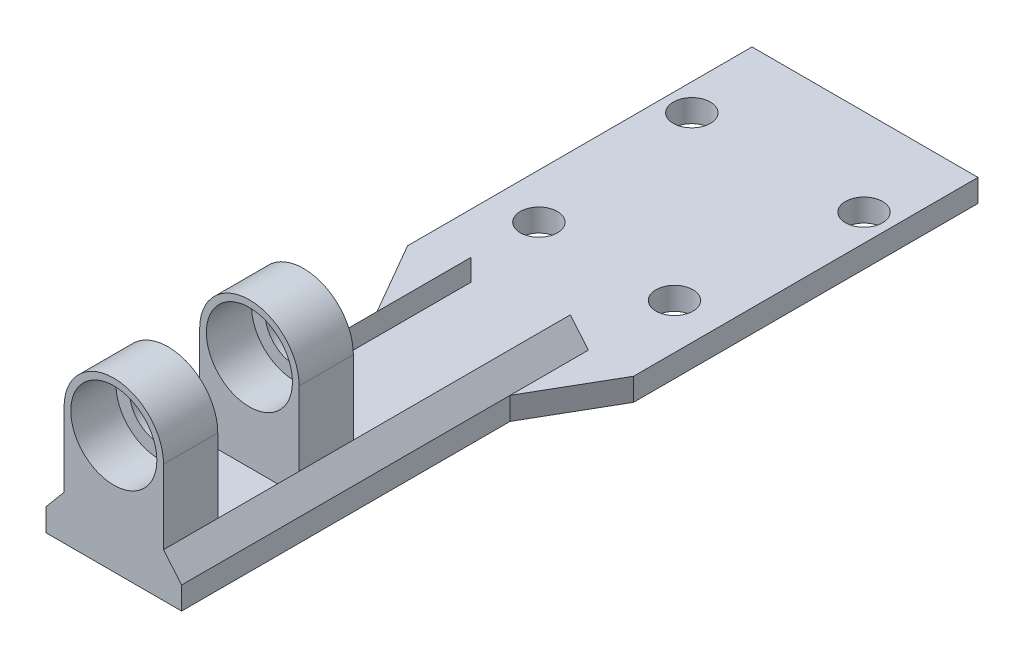
ISO-10303-21;
HEADER;
FILE_DESCRIPTION(('STEP AP214'),'2;1');
FILE_NAME('part.step','',(''),(''),'','','');
FILE_SCHEMA(('AUTOMOTIVE_DESIGN { 1 0 10303 214 1 1 1 1 }'));
ENDSEC;
DATA;
#1=APPLICATION_CONTEXT('core data for automotive mechanical design processes');
#2=APPLICATION_PROTOCOL_DEFINITION('international standard','automotive_design',2000,#1);
#3=PRODUCT_CONTEXT('',#1,'mechanical');
#4=PRODUCT('Part','Part','',(#3));
#5=PRODUCT_RELATED_PRODUCT_CATEGORY('part','',(#4));
#6=PRODUCT_DEFINITION_FORMATION('','',#4);
#7=PRODUCT_DEFINITION_CONTEXT('part definition',#1,'design');
#8=PRODUCT_DEFINITION('design','',#6,#7);
#9=PRODUCT_DEFINITION_SHAPE('','',#8);
#10=(LENGTH_UNIT() NAMED_UNIT(*) SI_UNIT(.MILLI.,.METRE.));
#11=(NAMED_UNIT(*) PLANE_ANGLE_UNIT() SI_UNIT($,.RADIAN.));
#12=(NAMED_UNIT(*) SI_UNIT($,.STERADIAN.) SOLID_ANGLE_UNIT());
#13=UNCERTAINTY_MEASURE_WITH_UNIT(LENGTH_MEASURE(1.E-05),#10,'distance_accuracy_value','');
#14=(GEOMETRIC_REPRESENTATION_CONTEXT(3) GLOBAL_UNCERTAINTY_ASSIGNED_CONTEXT((#13)) GLOBAL_UNIT_ASSIGNED_CONTEXT((#10,
#11,#12)) REPRESENTATION_CONTEXT('',''));
#15=CARTESIAN_POINT('',(0.,0.,0.));
#16=DIRECTION('',(0.,0.,1.));
#17=DIRECTION('',(1.,0.,0.));
#18=AXIS2_PLACEMENT_3D('',#15,#16,#17);
#19=CARTESIAN_POINT('',(0.,5.,0.));
#20=DIRECTION('',(0.,1.,0.));
#21=DIRECTION('',(0.,0.,1.));
#22=AXIS2_PLACEMENT_3D('',#19,#20,#21);
#23=PLANE('',#22);
#24=DIRECTION('',(0.,0.,1.));
#25=VECTOR('',#24,1.);
#26=CARTESIAN_POINT('',(11.,5.,-6.22289530744161));
#27=LINE('',#26,#25);
#28=CARTESIAN_POINT('',(11.,5.,0.));
#29=VERTEX_POINT('',#28);
#30=CARTESIAN_POINT('',(11.,5.,48.));
#31=VERTEX_POINT('',#30);
#32=EDGE_CURVE('E211',#29,#31,#27,.T.);
#33=ORIENTED_EDGE('',*,*,#32,.F.);
#34=DIRECTION('',(-1.,0.,0.));
#35=VECTOR('',#34,1.);
#36=CARTESIAN_POINT('',(11.,5.,0.));
#37=LINE('',#36,#35);
#38=CARTESIAN_POINT('',(15.,5.,0.));
#39=VERTEX_POINT('',#38);
#40=EDGE_CURVE('E195',#39,#29,#37,.T.);
#41=ORIENTED_EDGE('',*,*,#40,.F.);
#42=DIRECTION('',(0.,0.,1.));
#43=VECTOR('',#42,1.);
#44=CARTESIAN_POINT('',(15.,5.,-6.22289530744161));
#45=LINE('',#44,#43);
#46=CARTESIAN_POINT('',(15.,5.,17.3205080756889));
#47=VERTEX_POINT('',#46);
#48=EDGE_CURVE('E233',#39,#47,#45,.T.);
#49=ORIENTED_EDGE('',*,*,#48,.T.);
#50=DIRECTION('',(-0.499999999999998,0.,0.86602540378444));
#51=VECTOR('',#50,1.);
#52=CARTESIAN_POINT('',(15.,5.,17.3205080756889));
#53=LINE('',#52,#51);
#54=CARTESIAN_POINT('',(25.,5.,0.));
#55=VERTEX_POINT('',#54);
#56=EDGE_CURVE('E443',#55,#47,#53,.T.);
#57=ORIENTED_EDGE('',*,*,#56,.F.);
#58=DIRECTION('',(0.,0.,-1.));
#59=VECTOR('',#58,1.);
#60=CARTESIAN_POINT('',(25.,5.,-76.2));
#61=LINE('',#60,#59);
#62=CARTESIAN_POINT('',(25.,5.,-76.2));
#63=VERTEX_POINT('',#62);
#64=EDGE_CURVE('E318',#55,#63,#61,.T.);
#65=ORIENTED_EDGE('',*,*,#64,.T.);
#66=DIRECTION('',(-1.,0.,0.));
#67=VECTOR('',#66,1.);
#68=CARTESIAN_POINT('',(-25.0000000000001,5.,-76.2));
#69=LINE('',#68,#67);
#70=CARTESIAN_POINT('',(-25.0000000000001,5.,-76.2));
#71=VERTEX_POINT('',#70);
#72=EDGE_CURVE('E322',#63,#71,#69,.T.);
#73=ORIENTED_EDGE('',*,*,#72,.T.);
#74=DIRECTION('',(0.,0.,1.));
#75=VECTOR('',#74,1.);
#76=CARTESIAN_POINT('',(-25.0000000000001,5.,-38.1));
#77=LINE('',#76,#75);
#78=CARTESIAN_POINT('',(-25.,5.,0.));
#79=VERTEX_POINT('',#78);
#80=EDGE_CURVE('E326',#71,#79,#77,.T.);
#81=ORIENTED_EDGE('',*,*,#80,.T.);
#82=DIRECTION('',(-0.499999999999998,0.,-0.86602540378444));
#83=VECTOR('',#82,1.);
#84=CARTESIAN_POINT('',(-25.,5.,0.));
#85=LINE('',#84,#83);
#86=CARTESIAN_POINT('',(-15.,5.,17.3205080756889));
#87=VERTEX_POINT('',#86);
#88=EDGE_CURVE('E454',#87,#79,#85,.T.);
#89=ORIENTED_EDGE('',*,*,#88,.F.);
#90=DIRECTION('',(0.,0.,1.));
#91=VECTOR('',#90,1.);
#92=CARTESIAN_POINT('',(-15.,5.,-6.22289530744161));
#93=LINE('',#92,#91);
#94=CARTESIAN_POINT('',(-15.,5.,0.));
#95=VERTEX_POINT('',#94);
#96=EDGE_CURVE('E236',#95,#87,#93,.T.);
#97=ORIENTED_EDGE('',*,*,#96,.F.);
#98=DIRECTION('',(-1.,0.,0.));
#99=VECTOR('',#98,1.);
#100=CARTESIAN_POINT('',(-11.,5.,0.));
#101=LINE('',#100,#99);
#102=CARTESIAN_POINT('',(-11.,5.,0.));
#103=VERTEX_POINT('',#102);
#104=EDGE_CURVE('E244',#103,#95,#101,.T.);
#105=ORIENTED_EDGE('',*,*,#104,.F.);
#106=DIRECTION('',(0.,0.,1.));
#107=VECTOR('',#106,1.);
#108=CARTESIAN_POINT('',(-11.,5.,-6.22289530744161));
#109=LINE('',#108,#107);
#110=CARTESIAN_POINT('',(-11.,5.,48.));
#111=VERTEX_POINT('',#110);
#112=EDGE_CURVE('E248',#103,#111,#109,.T.);
#113=ORIENTED_EDGE('',*,*,#112,.T.);
#114=DIRECTION('',(1.,0.,0.));
#115=VECTOR('',#114,1.);
#116=CARTESIAN_POINT('',(15.,5.,48.));
#117=LINE('',#116,#115);
#118=EDGE_CURVE('E220',#111,#31,#117,.T.);
#119=ORIENTED_EDGE('',*,*,#118,.T.);
#120=EDGE_LOOP('',(#33,#41,#49,#57,#65,#73,#81,#89,#97,#105,#113,#119));
#121=FACE_BOUND('',#120,.T.);
#122=CARTESIAN_POINT('',(-19.05,5.,-56.9341325623275));
#123=DIRECTION('',(0.,1.,0.));
#124=DIRECTION('',(0.,0.,1.));
#125=AXIS2_PLACEMENT_3D('',#122,#123,#124);
#126=CIRCLE('',#125,4.1);
#127=CARTESIAN_POINT('',(-19.05,5.,-52.8341325623275));
#128=VERTEX_POINT('',#127);
#129=EDGE_CURVE('E277',#128,#128,#126,.T.);
#130=ORIENTED_EDGE('',*,*,#129,.F.);
#131=EDGE_LOOP('',(#130));
#132=FACE_BOUND('',#131,.T.);
#133=CARTESIAN_POINT('',(19.05,5.,-56.9341325623275));
#134=DIRECTION('',(0.,1.,0.));
#135=DIRECTION('',(0.,0.,1.));
#136=AXIS2_PLACEMENT_3D('',#133,#134,#135);
#137=CIRCLE('',#136,4.1);
#138=CARTESIAN_POINT('',(19.05,5.,-52.8341325623275));
#139=VERTEX_POINT('',#138);
#140=EDGE_CURVE('E306',#139,#139,#137,.T.);
#141=ORIENTED_EDGE('',*,*,#140,.F.);
#142=EDGE_LOOP('',(#141));
#143=FACE_BOUND('',#142,.T.);
#144=CARTESIAN_POINT('',(-15.0000000000001,5.,-19.05));
#145=DIRECTION('',(0.,1.,0.));
#146=DIRECTION('',(0.,0.,1.));
#147=AXIS2_PLACEMENT_3D('',#144,#145,#146);
#148=CIRCLE('',#147,4.1);
#149=CARTESIAN_POINT('',(-15.0000000000001,5.,-14.95));
#150=VERTEX_POINT('',#149);
#151=EDGE_CURVE('E310',#150,#150,#148,.T.);
#152=ORIENTED_EDGE('',*,*,#151,.F.);
#153=EDGE_LOOP('',(#152));
#154=FACE_BOUND('',#153,.T.);
#155=CARTESIAN_POINT('',(15.,5.,-19.05));
#156=DIRECTION('',(0.,1.,0.));
#157=DIRECTION('',(0.,0.,1.));
#158=AXIS2_PLACEMENT_3D('',#155,#156,#157);
#159=CIRCLE('',#158,4.1);
#160=CARTESIAN_POINT('',(15.,5.,-14.95));
#161=VERTEX_POINT('',#160);
#162=EDGE_CURVE('E314',#161,#161,#159,.T.);
#163=ORIENTED_EDGE('',*,*,#162,.F.);
#164=EDGE_LOOP('',(#163));
#165=FACE_BOUND('',#164,.T.);
#166=ADVANCED_FACE('F43',(#121,#132,#143,#154,#165),#23,.T.);
#167=CARTESIAN_POINT('',(11.,5.,60.));
#168=VERTEX_POINT('',#167);
#169=CARTESIAN_POINT('',(11.,5.,78.));
#170=VERTEX_POINT('',#169);
#171=EDGE_CURVE('E66',#168,#170,#27,.T.);
#172=ORIENTED_EDGE('',*,*,#171,.F.);
#173=DIRECTION('',(1.,0.,0.));
#174=VECTOR('',#173,1.);
#175=CARTESIAN_POINT('',(15.,5.,60.));
#176=LINE('',#175,#174);
#177=CARTESIAN_POINT('',(-11.,5.,60.));
#178=VERTEX_POINT('',#177);
#179=EDGE_CURVE('E342',#178,#168,#176,.T.);
#180=ORIENTED_EDGE('',*,*,#179,.F.);
#181=CARTESIAN_POINT('',(-11.,5.,78.));
#182=VERTEX_POINT('',#181);
#183=EDGE_CURVE('E251',#178,#182,#109,.T.);
#184=ORIENTED_EDGE('',*,*,#183,.T.);
#185=DIRECTION('',(1.,0.,0.));
#186=VECTOR('',#185,1.);
#187=CARTESIAN_POINT('',(15.,5.,78.));
#188=LINE('',#187,#186);
#189=EDGE_CURVE('E396',#182,#170,#188,.T.);
#190=ORIENTED_EDGE('',*,*,#189,.T.);
#191=EDGE_LOOP('',(#172,#180,#184,#190));
#192=FACE_BOUND('',#191,.T.);
#193=ADVANCED_FACE('F597',(#192),#23,.T.);
#194=CARTESIAN_POINT('',(-25.,5.,0.));
#195=DIRECTION('',(-0.86602540378444,0.,0.499999999999998));
#196=DIRECTION('',(0.499999999999998,0.,0.86602540378444));
#197=AXIS2_PLACEMENT_3D('',#194,#195,#196);
#198=PLANE('',#197);
#199=DIRECTION('',(-0.499999999999998,0.,-0.86602540378444));
#200=VECTOR('',#199,1.);
#201=CARTESIAN_POINT('',(-25.,0.,0.));
#202=LINE('',#201,#200);
#203=CARTESIAN_POINT('',(-15.,0.,17.3205080756889));
#204=VERTEX_POINT('',#203);
#205=CARTESIAN_POINT('',(-25.,0.,0.));
#206=VERTEX_POINT('',#205);
#207=EDGE_CURVE('E448',#204,#206,#202,.T.);
#208=ORIENTED_EDGE('',*,*,#207,.F.);
#209=DIRECTION('',(0.,-1.,0.));
#210=VECTOR('',#209,1.);
#211=CARTESIAN_POINT('',(-15.,5.,17.3205080756889));
#212=LINE('',#211,#210);
#213=EDGE_CURVE('E479',#87,#204,#212,.T.);
#214=ORIENTED_EDGE('',*,*,#213,.F.);
#215=ORIENTED_EDGE('',*,*,#88,.T.);
#216=DIRECTION('',(0.,-1.,0.));
#217=VECTOR('',#216,1.);
#218=CARTESIAN_POINT('',(-25.,5.,0.));
#219=LINE('',#218,#217);
#220=EDGE_CURVE('E476',#79,#206,#219,.T.);
#221=ORIENTED_EDGE('',*,*,#220,.T.);
#222=EDGE_LOOP('',(#208,#214,#215,#221));
#223=FACE_BOUND('',#222,.T.);
#224=ADVANCED_FACE('F569',(#223),#198,.T.);
#225=CARTESIAN_POINT('',(-15.,5.,17.3205080756889));
#226=DIRECTION('',(-1.,0.,0.));
#227=DIRECTION('',(0.,0.,1.));
#228=AXIS2_PLACEMENT_3D('',#225,#226,#227);
#229=PLANE('',#228);
#230=DIRECTION('',(0.,0.,-1.));
#231=VECTOR('',#230,1.);
#232=CARTESIAN_POINT('',(-15.,0.,17.3205080756889));
#233=LINE('',#232,#231);
#234=CARTESIAN_POINT('',(-15.,0.,90.));
#235=VERTEX_POINT('',#234);
#236=EDGE_CURVE('E469',#235,#204,#233,.T.);
#237=ORIENTED_EDGE('',*,*,#236,.F.);
#238=DIRECTION('',(0.,-1.,0.));
#239=VECTOR('',#238,1.);
#240=CARTESIAN_POINT('',(-15.,5.,90.));
#241=LINE('',#240,#239);
#242=CARTESIAN_POINT('',(-15.,5.,90.));
#243=VERTEX_POINT('',#242);
#244=EDGE_CURVE('E482',#243,#235,#241,.T.);
#245=ORIENTED_EDGE('',*,*,#244,.F.);
#246=DIRECTION('',(0.,0.,-1.));
#247=VECTOR('',#246,1.);
#248=CARTESIAN_POINT('',(-15.,5.,17.3205080756889));
#249=LINE('',#248,#247);
#250=EDGE_CURVE('E451',#243,#87,#249,.T.);
#251=ORIENTED_EDGE('',*,*,#250,.T.);
#252=ORIENTED_EDGE('',*,*,#213,.T.);
#253=EDGE_LOOP('',(#237,#245,#251,#252));
#254=FACE_BOUND('',#253,.T.);
#255=ADVANCED_FACE('F577',(#254),#229,.T.);
#256=CARTESIAN_POINT('',(-15.,5.,90.));
#257=DIRECTION('',(0.,0.,1.));
#258=DIRECTION('',(1.,0.,0.));
#259=AXIS2_PLACEMENT_3D('',#256,#257,#258);
#260=PLANE('',#259);
#261=DIRECTION('',(0.,-1.,0.));
#262=VECTOR('',#261,1.);
#263=CARTESIAN_POINT('',(15.,5.,90.));
#264=LINE('',#263,#262);
#265=CARTESIAN_POINT('',(15.,5.,90.));
#266=VERTEX_POINT('',#265);
#267=CARTESIAN_POINT('',(15.,0.,90.));
#268=VERTEX_POINT('',#267);
#269=EDGE_CURVE('E485',#266,#268,#264,.T.);
#270=ORIENTED_EDGE('',*,*,#269,.F.);
#271=DIRECTION('',(-0.642787609686544,0.766044443118974,0.));
#272=VECTOR('',#271,1.);
#273=CARTESIAN_POINT('',(11.,9.76701437037679,90.));
#274=LINE('',#273,#272);
#275=CARTESIAN_POINT('',(11.,9.76701437037679,90.));
#276=VERTEX_POINT('',#275);
#277=EDGE_CURVE('E392',#266,#276,#274,.T.);
#278=ORIENTED_EDGE('',*,*,#277,.T.);
#279=DIRECTION('',(0.,1.,0.));
#280=VECTOR('',#279,1.);
#281=CARTESIAN_POINT('',(11.,26.15,90.));
#282=LINE('',#281,#280);
#283=CARTESIAN_POINT('',(11.,26.15,90.));
#284=VERTEX_POINT('',#283);
#285=EDGE_CURVE('E416',#276,#284,#282,.T.);
#286=ORIENTED_EDGE('',*,*,#285,.T.);
#287=CARTESIAN_POINT('',(0.,26.15,90.));
#288=DIRECTION('',(0.,0.,1.));
#289=DIRECTION('',(1.,0.,0.));
#290=AXIS2_PLACEMENT_3D('',#287,#288,#289);
#291=CIRCLE('',#290,11.);
#292=CARTESIAN_POINT('',(-11.,26.15,90.));
#293=VERTEX_POINT('',#292);
#294=EDGE_CURVE('E420',#284,#293,#291,.T.);
#295=ORIENTED_EDGE('',*,*,#294,.T.);
#296=DIRECTION('',(0.,-1.,0.));
#297=VECTOR('',#296,1.);
#298=CARTESIAN_POINT('',(-11.,9.76701437037679,90.));
#299=LINE('',#298,#297);
#300=CARTESIAN_POINT('',(-11.,9.76701437037679,90.));
#301=VERTEX_POINT('',#300);
#302=EDGE_CURVE('E424',#293,#301,#299,.T.);
#303=ORIENTED_EDGE('',*,*,#302,.T.);
#304=DIRECTION('',(-0.642787609686543,-0.766044443118975,0.));
#305=VECTOR('',#304,1.);
#306=CARTESIAN_POINT('',(-15.,5.,90.));
#307=LINE('',#306,#305);
#308=EDGE_CURVE('E400',#301,#243,#307,.T.);
#309=ORIENTED_EDGE('',*,*,#308,.T.);
#310=ORIENTED_EDGE('',*,*,#244,.T.);
#311=DIRECTION('',(-1.,0.,0.));
#312=VECTOR('',#311,1.);
#313=CARTESIAN_POINT('',(-15.,0.,90.));
#314=LINE('',#313,#312);
#315=EDGE_CURVE('E465',#268,#235,#314,.T.);
#316=ORIENTED_EDGE('',*,*,#315,.F.);
#317=EDGE_LOOP('',(#270,#278,#286,#295,#303,#309,#310,#316));
#318=FACE_BOUND('',#317,.T.);
#319=CARTESIAN_POINT('',(0.,26.15,90.));
#320=DIRECTION('',(0.,0.,1.));
#321=DIRECTION('',(1.,0.,0.));
#322=AXIS2_PLACEMENT_3D('',#319,#320,#321);
#323=CIRCLE('',#322,9.525);
#324=CARTESIAN_POINT('',(9.525,26.15,90.));
#325=VERTEX_POINT('',#324);
#326=EDGE_CURVE('E378',#325,#325,#323,.T.);
#327=ORIENTED_EDGE('',*,*,#326,.F.);
#328=EDGE_LOOP('',(#327));
#329=FACE_BOUND('',#328,.T.);
#330=ADVANCED_FACE('F542',(#318,#329),#260,.T.);
#331=CARTESIAN_POINT('',(15.,5.,90.));
#332=DIRECTION('',(1.,0.,0.));
#333=DIRECTION('',(0.,0.,-1.));
#334=AXIS2_PLACEMENT_3D('',#331,#332,#333);
#335=PLANE('',#334);
#336=DIRECTION('',(0.,0.,1.));
#337=VECTOR('',#336,1.);
#338=CARTESIAN_POINT('',(15.,0.,90.));
#339=LINE('',#338,#337);
#340=CARTESIAN_POINT('',(15.,0.,17.3205080756889));
#341=VERTEX_POINT('',#340);
#342=EDGE_CURVE('E461',#341,#268,#339,.T.);
#343=ORIENTED_EDGE('',*,*,#342,.F.);
#344=DIRECTION('',(0.,-1.,0.));
#345=VECTOR('',#344,1.);
#346=CARTESIAN_POINT('',(15.,5.,17.3205080756889));
#347=LINE('',#346,#345);
#348=EDGE_CURVE('E488',#47,#341,#347,.T.);
#349=ORIENTED_EDGE('',*,*,#348,.F.);
#350=DIRECTION('',(0.,0.,1.));
#351=VECTOR('',#350,1.);
#352=CARTESIAN_POINT('',(15.,5.,90.));
#353=LINE('',#352,#351);
#354=EDGE_CURVE('E447',#47,#266,#353,.T.);
#355=ORIENTED_EDGE('',*,*,#354,.T.);
#356=ORIENTED_EDGE('',*,*,#269,.T.);
#357=EDGE_LOOP('',(#343,#349,#355,#356));
#358=FACE_BOUND('',#357,.T.);
#359=ADVANCED_FACE('F547',(#358),#335,.T.);
#360=CARTESIAN_POINT('',(15.,5.,17.3205080756889));
#361=DIRECTION('',(0.86602540378444,0.,0.499999999999998));
#362=DIRECTION('',(0.499999999999998,0.,-0.86602540378444));
#363=AXIS2_PLACEMENT_3D('',#360,#361,#362);
#364=PLANE('',#363);
#365=DIRECTION('',(-0.499999999999998,0.,0.86602540378444));
#366=VECTOR('',#365,1.);
#367=CARTESIAN_POINT('',(15.,0.,17.3205080756889));
#368=LINE('',#367,#366);
#369=CARTESIAN_POINT('',(25.,0.,0.));
#370=VERTEX_POINT('',#369);
#371=EDGE_CURVE('E434',#370,#341,#368,.T.);
#372=ORIENTED_EDGE('',*,*,#371,.F.);
#373=DIRECTION('',(0.,-1.,0.));
#374=VECTOR('',#373,1.);
#375=CARTESIAN_POINT('',(25.,5.,0.));
#376=LINE('',#375,#374);
#377=EDGE_CURVE('E457',#55,#370,#376,.T.);
#378=ORIENTED_EDGE('',*,*,#377,.F.);
#379=ORIENTED_EDGE('',*,*,#56,.T.);
#380=ORIENTED_EDGE('',*,*,#348,.T.);
#381=EDGE_LOOP('',(#372,#378,#379,#380));
#382=FACE_BOUND('',#381,.T.);
#383=ADVANCED_FACE('F45',(#382),#364,.T.);
#384=CARTESIAN_POINT('',(0.,0.,0.));
#385=DIRECTION('',(0.,1.,0.));
#386=DIRECTION('',(0.,0.,1.));
#387=AXIS2_PLACEMENT_3D('',#384,#385,#386);
#388=PLANE('',#387);
#389=ORIENTED_EDGE('',*,*,#207,.T.);
#390=DIRECTION('',(0.,0.,-1.));
#391=VECTOR('',#390,1.);
#392=CARTESIAN_POINT('',(-25.0000000000001,0.,-38.1));
#393=LINE('',#392,#391);
#394=CARTESIAN_POINT('',(-25.0000000000001,0.,-76.2));
#395=VERTEX_POINT('',#394);
#396=EDGE_CURVE('E288',#206,#395,#393,.T.);
#397=ORIENTED_EDGE('',*,*,#396,.T.);
#398=DIRECTION('',(1.,0.,0.));
#399=VECTOR('',#398,1.);
#400=CARTESIAN_POINT('',(-25.0000000000001,0.,-76.2));
#401=LINE('',#400,#399);
#402=CARTESIAN_POINT('',(25.,0.,-76.2));
#403=VERTEX_POINT('',#402);
#404=EDGE_CURVE('E297',#395,#403,#401,.T.);
#405=ORIENTED_EDGE('',*,*,#404,.T.);
#406=DIRECTION('',(0.,0.,1.));
#407=VECTOR('',#406,1.);
#408=CARTESIAN_POINT('',(25.,0.,-76.2));
#409=LINE('',#408,#407);
#410=EDGE_CURVE('E293',#403,#370,#409,.T.);
#411=ORIENTED_EDGE('',*,*,#410,.T.);
#412=ORIENTED_EDGE('',*,*,#371,.T.);
#413=ORIENTED_EDGE('',*,*,#342,.T.);
#414=ORIENTED_EDGE('',*,*,#315,.T.);
#415=ORIENTED_EDGE('',*,*,#236,.T.);
#416=EDGE_LOOP('',(#389,#397,#405,#411,#412,#413,#414,#415));
#417=FACE_BOUND('',#416,.T.);
#418=CARTESIAN_POINT('',(-15.0000000000001,0.,-19.05));
#419=DIRECTION('',(0.,1.,0.));
#420=DIRECTION('',(0.,0.,1.));
#421=AXIS2_PLACEMENT_3D('',#418,#419,#420);
#422=CIRCLE('',#421,4.1);
#423=CARTESIAN_POINT('',(-15.0000000000001,0.,-14.95));
#424=VERTEX_POINT('',#423);
#425=EDGE_CURVE('E284',#424,#424,#422,.F.);
#426=ORIENTED_EDGE('',*,*,#425,.F.);
#427=EDGE_LOOP('',(#426));
#428=FACE_BOUND('',#427,.T.);
#429=CARTESIAN_POINT('',(-19.05,0.,-56.9341325623275));
#430=DIRECTION('',(0.,1.,0.));
#431=DIRECTION('',(0.,0.,1.));
#432=AXIS2_PLACEMENT_3D('',#429,#430,#431);
#433=CIRCLE('',#432,4.1);
#434=CARTESIAN_POINT('',(-19.05,0.,-52.8341325623275));
#435=VERTEX_POINT('',#434);
#436=EDGE_CURVE('E283',#435,#435,#433,.F.);
#437=ORIENTED_EDGE('',*,*,#436,.F.);
#438=EDGE_LOOP('',(#437));
#439=FACE_BOUND('',#438,.T.);
#440=CARTESIAN_POINT('',(19.05,0.,-56.9341325623275));
#441=DIRECTION('',(0.,1.,0.));
#442=DIRECTION('',(0.,0.,1.));
#443=AXIS2_PLACEMENT_3D('',#440,#441,#442);
#444=CIRCLE('',#443,4.1);
#445=CARTESIAN_POINT('',(19.05,0.,-52.8341325623275));
#446=VERTEX_POINT('',#445);
#447=EDGE_CURVE('E278',#446,#446,#444,.F.);
#448=ORIENTED_EDGE('',*,*,#447,.F.);
#449=EDGE_LOOP('',(#448));
#450=FACE_BOUND('',#449,.T.);
#451=CARTESIAN_POINT('',(15.,0.,-19.05));
#452=DIRECTION('',(0.,1.,0.));
#453=DIRECTION('',(0.,0.,1.));
#454=AXIS2_PLACEMENT_3D('',#451,#452,#453);
#455=CIRCLE('',#454,4.1);
#456=CARTESIAN_POINT('',(15.,0.,-14.95));
#457=VERTEX_POINT('',#456);
#458=EDGE_CURVE('E282',#457,#457,#455,.F.);
#459=ORIENTED_EDGE('',*,*,#458,.F.);
#460=EDGE_LOOP('',(#459));
#461=FACE_BOUND('',#460,.T.);
#462=ADVANCED_FACE('F572',(#417,#428,#439,#450,#461),#388,.F.);
#463=CARTESIAN_POINT('',(-15.,5.,78.));
#464=DIRECTION('',(-0.766044443118975,0.642787609686543,0.));
#465=DIRECTION('',(-0.642787609686543,-0.766044443118975,0.));
#466=AXIS2_PLACEMENT_3D('',#463,#464,#465);
#467=PLANE('',#466);
#468=ORIENTED_EDGE('',*,*,#308,.F.);
#469=DIRECTION('',(0.,0.,1.));
#470=VECTOR('',#469,1.);
#471=CARTESIAN_POINT('',(-11.,9.76701437037679,78.));
#472=LINE('',#471,#470);
#473=CARTESIAN_POINT('',(-11.,9.76701437037679,78.));
#474=VERTEX_POINT('',#473);
#475=EDGE_CURVE('E431',#474,#301,#472,.T.);
#476=ORIENTED_EDGE('',*,*,#475,.F.);
#477=DIRECTION('',(0.,0.,1.));
#478=VECTOR('',#477,1.);
#479=CARTESIAN_POINT('',(-11.,9.76701437037679,-6.22289530744161));
#480=LINE('',#479,#478);
#481=CARTESIAN_POINT('',(-11.,9.76701437037679,60.));
#482=VERTEX_POINT('',#481);
#483=EDGE_CURVE('E247',#482,#474,#480,.T.);
#484=ORIENTED_EDGE('',*,*,#483,.F.);
#485=DIRECTION('',(0.,0.,1.));
#486=VECTOR('',#485,1.);
#487=CARTESIAN_POINT('',(-11.,9.76701437037679,48.));
#488=LINE('',#487,#486);
#489=CARTESIAN_POINT('',(-11.,9.76701437037679,48.));
#490=VERTEX_POINT('',#489);
#491=EDGE_CURVE('E374',#490,#482,#488,.T.);
#492=ORIENTED_EDGE('',*,*,#491,.F.);
#493=CARTESIAN_POINT('',(-11.,9.76701437037679,0.));
#494=VERTEX_POINT('',#493);
#495=EDGE_CURVE('E241',#494,#490,#480,.T.);
#496=ORIENTED_EDGE('',*,*,#495,.F.);
#497=DIRECTION('',(0.642787609686543,0.766044443118975,0.));
#498=VECTOR('',#497,1.);
#499=CARTESIAN_POINT('',(-11.,9.76701437037679,0.));
#500=LINE('',#499,#498);
#501=EDGE_CURVE('E240',#95,#494,#500,.T.);
#502=ORIENTED_EDGE('',*,*,#501,.F.);
#503=ORIENTED_EDGE('',*,*,#96,.T.);
#504=ORIENTED_EDGE('',*,*,#250,.F.);
#505=EDGE_LOOP('',(#468,#476,#484,#492,#496,#502,#503,#504));
#506=FACE_BOUND('',#505,.T.);
#507=ADVANCED_FACE('F509',(#506),#467,.T.);
#508=CARTESIAN_POINT('',(-11.,9.76701437037679,78.));
#509=DIRECTION('',(-1.,0.,0.));
#510=DIRECTION('',(0.,-1.,0.));
#511=AXIS2_PLACEMENT_3D('',#508,#509,#510);
#512=PLANE('',#511);
#513=ORIENTED_EDGE('',*,*,#302,.F.);
#514=DIRECTION('',(0.,0.,1.));
#515=VECTOR('',#514,1.);
#516=CARTESIAN_POINT('',(-11.,26.15,78.));
#517=LINE('',#516,#515);
#518=CARTESIAN_POINT('',(-11.,26.15,78.));
#519=VERTEX_POINT('',#518);
#520=EDGE_CURVE('E435',#519,#293,#517,.T.);
#521=ORIENTED_EDGE('',*,*,#520,.F.);
#522=DIRECTION('',(0.,-1.,0.));
#523=VECTOR('',#522,1.);
#524=CARTESIAN_POINT('',(-11.,9.76701437037679,78.));
#525=LINE('',#524,#523);
#526=EDGE_CURVE('E408',#519,#474,#525,.T.);
#527=ORIENTED_EDGE('',*,*,#526,.T.);
#528=ORIENTED_EDGE('',*,*,#475,.T.);
#529=EDGE_LOOP('',(#513,#521,#527,#528));
#530=FACE_BOUND('',#529,.T.);
#531=ADVANCED_FACE('F630',(#530),#512,.T.);
#532=CARTESIAN_POINT('',(0.,26.15,78.));
#533=DIRECTION('',(0.,0.,1.));
#534=DIRECTION('',(1.,0.,0.));
#535=AXIS2_PLACEMENT_3D('',#532,#533,#534);
#536=CYLINDRICAL_SURFACE('',#535,11.);
#537=ORIENTED_EDGE('',*,*,#294,.F.);
#538=DIRECTION('',(0.,0.,1.));
#539=VECTOR('',#538,1.);
#540=CARTESIAN_POINT('',(11.,26.15,78.));
#541=LINE('',#540,#539);
#542=CARTESIAN_POINT('',(11.,26.15,78.));
#543=VERTEX_POINT('',#542);
#544=EDGE_CURVE('E438',#543,#284,#541,.T.);
#545=ORIENTED_EDGE('',*,*,#544,.F.);
#546=CARTESIAN_POINT('',(0.,26.15,78.));
#547=DIRECTION('',(0.,0.,1.));
#548=DIRECTION('',(1.,0.,0.));
#549=AXIS2_PLACEMENT_3D('',#546,#547,#548);
#550=CIRCLE('',#549,11.);
#551=EDGE_CURVE('E404',#543,#519,#550,.T.);
#552=ORIENTED_EDGE('',*,*,#551,.T.);
#553=ORIENTED_EDGE('',*,*,#520,.T.);
#554=EDGE_LOOP('',(#537,#545,#552,#553));
#555=FACE_BOUND('',#554,.T.);
#556=ADVANCED_FACE('F637',(#555),#536,.T.);
#557=CARTESIAN_POINT('',(11.,26.15,78.));
#558=DIRECTION('',(1.,0.,0.));
#559=DIRECTION('',(0.,1.,0.));
#560=AXIS2_PLACEMENT_3D('',#557,#558,#559);
#561=PLANE('',#560);
#562=ORIENTED_EDGE('',*,*,#285,.F.);
#563=DIRECTION('',(0.,0.,1.));
#564=VECTOR('',#563,1.);
#565=CARTESIAN_POINT('',(11.,9.76701437037679,78.));
#566=LINE('',#565,#564);
#567=CARTESIAN_POINT('',(11.,9.76701437037679,78.));
#568=VERTEX_POINT('',#567);
#569=EDGE_CURVE('E412',#568,#276,#566,.T.);
#570=ORIENTED_EDGE('',*,*,#569,.F.);
#571=DIRECTION('',(0.,1.,0.));
#572=VECTOR('',#571,1.);
#573=CARTESIAN_POINT('',(11.,26.15,78.));
#574=LINE('',#573,#572);
#575=EDGE_CURVE('E399',#568,#543,#574,.T.);
#576=ORIENTED_EDGE('',*,*,#575,.T.);
#577=ORIENTED_EDGE('',*,*,#544,.T.);
#578=EDGE_LOOP('',(#562,#570,#576,#577));
#579=FACE_BOUND('',#578,.T.);
#580=ADVANCED_FACE('F539',(#579),#561,.T.);
#581=CARTESIAN_POINT('',(11.,9.76701437037679,78.));
#582=DIRECTION('',(0.766044443118974,0.642787609686544,0.));
#583=DIRECTION('',(-0.642787609686544,0.766044443118974,0.));
#584=AXIS2_PLACEMENT_3D('',#581,#582,#583);
#585=PLANE('',#584);
#586=ORIENTED_EDGE('',*,*,#277,.F.);
#587=ORIENTED_EDGE('',*,*,#354,.F.);
#588=ORIENTED_EDGE('',*,*,#48,.F.);
#589=DIRECTION('',(0.642787609686544,-0.766044443118974,0.));
#590=VECTOR('',#589,1.);
#591=CARTESIAN_POINT('',(15.,5.,0.));
#592=LINE('',#591,#590);
#593=CARTESIAN_POINT('',(11.,9.76701437037679,0.));
#594=VERTEX_POINT('',#593);
#595=EDGE_CURVE('E201',#594,#39,#592,.T.);
#596=ORIENTED_EDGE('',*,*,#595,.F.);
#597=DIRECTION('',(0.,0.,1.));
#598=VECTOR('',#597,1.);
#599=CARTESIAN_POINT('',(11.,9.76701437037679,-6.22289530744161));
#600=LINE('',#599,#598);
#601=CARTESIAN_POINT('',(11.,9.76701437037679,48.));
#602=VERTEX_POINT('',#601);
#603=EDGE_CURVE('E213',#594,#602,#600,.T.);
#604=ORIENTED_EDGE('',*,*,#603,.T.);
#605=DIRECTION('',(0.,0.,1.));
#606=VECTOR('',#605,1.);
#607=CARTESIAN_POINT('',(11.,9.76701437037679,48.));
#608=LINE('',#607,#606);
#609=CARTESIAN_POINT('',(11.,9.76701437037679,60.));
#610=VERTEX_POINT('',#609);
#611=EDGE_CURVE('E361',#602,#610,#608,.T.);
#612=ORIENTED_EDGE('',*,*,#611,.T.);
#613=EDGE_CURVE('E222',#610,#568,#600,.T.);
#614=ORIENTED_EDGE('',*,*,#613,.T.);
#615=ORIENTED_EDGE('',*,*,#569,.T.);
#616=EDGE_LOOP('',(#586,#587,#588,#596,#604,#612,#614,#615));
#617=FACE_BOUND('',#616,.T.);
#618=ADVANCED_FACE('F517',(#617),#585,.T.);
#619=CARTESIAN_POINT('',(0.,26.15,78.));
#620=DIRECTION('',(0.,0.,1.));
#621=DIRECTION('',(1.,0.,0.));
#622=AXIS2_PLACEMENT_3D('',#619,#620,#621);
#623=PLANE('',#622);
#624=CARTESIAN_POINT('',(0.,26.15,78.));
#625=DIRECTION('',(0.,0.,1.));
#626=DIRECTION('',(1.,0.,0.));
#627=AXIS2_PLACEMENT_3D('',#624,#625,#626);
#628=CIRCLE('',#627,6.5);
#629=CARTESIAN_POINT('',(6.5,26.15,78.));
#630=VERTEX_POINT('',#629);
#631=EDGE_CURVE('E273',#630,#630,#628,.T.);
#632=ORIENTED_EDGE('',*,*,#631,.T.);
#633=EDGE_LOOP('',(#632));
#634=FACE_BOUND('',#633,.T.);
#635=ORIENTED_EDGE('',*,*,#575,.F.);
#636=DIRECTION('',(0.,-1.,0.));
#637=VECTOR('',#636,1.);
#638=CARTESIAN_POINT('',(11.,26.15,78.));
#639=LINE('',#638,#637);
#640=EDGE_CURVE('E59',#568,#170,#639,.T.);
#641=ORIENTED_EDGE('',*,*,#640,.T.);
#642=ORIENTED_EDGE('',*,*,#189,.F.);
#643=DIRECTION('',(0.,1.,0.));
#644=VECTOR('',#643,1.);
#645=CARTESIAN_POINT('',(-11.,26.15,78.));
#646=LINE('',#645,#644);
#647=EDGE_CURVE('E261',#182,#474,#646,.T.);
#648=ORIENTED_EDGE('',*,*,#647,.T.);
#649=ORIENTED_EDGE('',*,*,#526,.F.);
#650=ORIENTED_EDGE('',*,*,#551,.F.);
#651=EDGE_LOOP('',(#635,#641,#642,#648,#649,#650));
#652=FACE_BOUND('',#651,.T.);
#653=ADVANCED_FACE('F658',(#634,#652),#623,.F.);
#654=CARTESIAN_POINT('',(0.,26.15,80.));
#655=DIRECTION('',(0.,0.,1.));
#656=DIRECTION('',(1.,0.,0.));
#657=AXIS2_PLACEMENT_3D('',#654,#655,#656);
#658=CYLINDRICAL_SURFACE('',#657,9.525);
#659=CARTESIAN_POINT('',(0.,26.15,80.));
#660=DIRECTION('',(0.,0.,1.));
#661=DIRECTION('',(1.,0.,0.));
#662=AXIS2_PLACEMENT_3D('',#659,#660,#661);
#663=CIRCLE('',#662,9.525);
#664=CARTESIAN_POINT('',(9.525,26.15,80.));
#665=VERTEX_POINT('',#664);
#666=EDGE_CURVE('E388',#665,#665,#663,.T.);
#667=ORIENTED_EDGE('',*,*,#666,.F.);
#668=EDGE_LOOP('',(#667));
#669=FACE_BOUND('',#668,.T.);
#670=ORIENTED_EDGE('',*,*,#326,.T.);
#671=EDGE_LOOP('',(#670));
#672=FACE_BOUND('',#671,.T.);
#673=ADVANCED_FACE('F664',(#669,#672),#658,.F.);
#674=CARTESIAN_POINT('',(0.,26.15,80.));
#675=DIRECTION('',(0.,0.,1.));
#676=DIRECTION('',(1.,0.,0.));
#677=AXIS2_PLACEMENT_3D('',#674,#675,#676);
#678=PLANE('',#677);
#679=CARTESIAN_POINT('',(0.,26.15,80.));
#680=DIRECTION('',(0.,0.,1.));
#681=DIRECTION('',(1.,0.,0.));
#682=AXIS2_PLACEMENT_3D('',#679,#680,#681);
#683=CIRCLE('',#682,6.5);
#684=CARTESIAN_POINT('',(6.5,26.15,80.));
#685=VERTEX_POINT('',#684);
#686=EDGE_CURVE('E264',#685,#685,#683,.T.);
#687=ORIENTED_EDGE('',*,*,#686,.F.);
#688=EDGE_LOOP('',(#687));
#689=FACE_BOUND('',#688,.T.);
#690=ORIENTED_EDGE('',*,*,#666,.T.);
#691=EDGE_LOOP('',(#690));
#692=FACE_BOUND('',#691,.T.);
#693=ADVANCED_FACE('F672',(#689,#692),#678,.T.);
#694=CARTESIAN_POINT('',(-11.,9.76701437037679,48.));
#695=DIRECTION('',(-1.,0.,0.));
#696=DIRECTION('',(0.,-1.,0.));
#697=AXIS2_PLACEMENT_3D('',#694,#695,#696);
#698=PLANE('',#697);
#699=DIRECTION('',(0.,-1.,0.));
#700=VECTOR('',#699,1.);
#701=CARTESIAN_POINT('',(-11.,9.76701437037679,60.));
#702=LINE('',#701,#700);
#703=CARTESIAN_POINT('',(-11.,26.15,60.));
#704=VERTEX_POINT('',#703);
#705=EDGE_CURVE('E349',#704,#482,#702,.T.);
#706=ORIENTED_EDGE('',*,*,#705,.F.);
#707=DIRECTION('',(0.,0.,1.));
#708=VECTOR('',#707,1.);
#709=CARTESIAN_POINT('',(-11.,26.15,48.));
#710=LINE('',#709,#708);
#711=CARTESIAN_POINT('',(-11.,26.15,48.));
#712=VERTEX_POINT('',#711);
#713=EDGE_CURVE('E379',#712,#704,#710,.T.);
#714=ORIENTED_EDGE('',*,*,#713,.F.);
#715=DIRECTION('',(0.,-1.,0.));
#716=VECTOR('',#715,1.);
#717=CARTESIAN_POINT('',(-11.,9.76701437037679,48.));
#718=LINE('',#717,#716);
#719=EDGE_CURVE('E357',#712,#490,#718,.T.);
#720=ORIENTED_EDGE('',*,*,#719,.T.);
#721=ORIENTED_EDGE('',*,*,#491,.T.);
#722=EDGE_LOOP('',(#706,#714,#720,#721));
#723=FACE_BOUND('',#722,.T.);
#724=ADVANCED_FACE('F681',(#723),#698,.T.);
#725=CARTESIAN_POINT('',(0.,26.15,48.));
#726=DIRECTION('',(0.,0.,1.));
#727=DIRECTION('',(1.,0.,0.));
#728=AXIS2_PLACEMENT_3D('',#725,#726,#727);
#729=CYLINDRICAL_SURFACE('',#728,11.);
#730=CARTESIAN_POINT('',(0.,26.15,60.));
#731=DIRECTION('',(0.,0.,1.));
#732=DIRECTION('',(1.,0.,0.));
#733=AXIS2_PLACEMENT_3D('',#730,#731,#732);
#734=CIRCLE('',#733,11.);
#735=CARTESIAN_POINT('',(11.,26.15,60.));
#736=VERTEX_POINT('',#735);
#737=EDGE_CURVE('E368',#736,#704,#734,.T.);
#738=ORIENTED_EDGE('',*,*,#737,.F.);
#739=DIRECTION('',(0.,0.,1.));
#740=VECTOR('',#739,1.);
#741=CARTESIAN_POINT('',(11.,26.15,48.));
#742=LINE('',#741,#740);
#743=CARTESIAN_POINT('',(11.,26.15,48.));
#744=VERTEX_POINT('',#743);
#745=EDGE_CURVE('E382',#744,#736,#742,.T.);
#746=ORIENTED_EDGE('',*,*,#745,.F.);
#747=CARTESIAN_POINT('',(0.,26.15,48.));
#748=DIRECTION('',(0.,0.,1.));
#749=DIRECTION('',(1.,0.,0.));
#750=AXIS2_PLACEMENT_3D('',#747,#748,#749);
#751=CIRCLE('',#750,11.);
#752=EDGE_CURVE('E353',#744,#712,#751,.T.);
#753=ORIENTED_EDGE('',*,*,#752,.T.);
#754=ORIENTED_EDGE('',*,*,#713,.T.);
#755=EDGE_LOOP('',(#738,#746,#753,#754));
#756=FACE_BOUND('',#755,.T.);
#757=ADVANCED_FACE('F529',(#756),#729,.T.);
#758=CARTESIAN_POINT('',(11.,26.15,48.));
#759=DIRECTION('',(1.,0.,0.));
#760=DIRECTION('',(0.,1.,0.));
#761=AXIS2_PLACEMENT_3D('',#758,#759,#760);
#762=PLANE('',#761);
#763=DIRECTION('',(0.,1.,0.));
#764=VECTOR('',#763,1.);
#765=CARTESIAN_POINT('',(11.,26.15,60.));
#766=LINE('',#765,#764);
#767=EDGE_CURVE('E364',#610,#736,#766,.T.);
#768=ORIENTED_EDGE('',*,*,#767,.F.);
#769=ORIENTED_EDGE('',*,*,#611,.F.);
#770=DIRECTION('',(0.,1.,0.));
#771=VECTOR('',#770,1.);
#772=CARTESIAN_POINT('',(11.,26.15,48.));
#773=LINE('',#772,#771);
#774=EDGE_CURVE('E348',#602,#744,#773,.T.);
#775=ORIENTED_EDGE('',*,*,#774,.T.);
#776=ORIENTED_EDGE('',*,*,#745,.T.);
#777=EDGE_LOOP('',(#768,#769,#775,#776));
#778=FACE_BOUND('',#777,.T.);
#779=ADVANCED_FACE('F523',(#778),#762,.T.);
#780=CARTESIAN_POINT('',(0.,26.15,48.));
#781=DIRECTION('',(0.,0.,1.));
#782=DIRECTION('',(1.,0.,0.));
#783=AXIS2_PLACEMENT_3D('',#780,#781,#782);
#784=PLANE('',#783);
#785=CARTESIAN_POINT('',(0.,26.15,48.));
#786=DIRECTION('',(0.,0.,1.));
#787=DIRECTION('',(1.,0.,0.));
#788=AXIS2_PLACEMENT_3D('',#785,#786,#787);
#789=CIRCLE('',#788,6.5);
#790=CARTESIAN_POINT('',(6.5,26.15,48.));
#791=VERTEX_POINT('',#790);
#792=EDGE_CURVE('E269',#791,#791,#789,.T.);
#793=ORIENTED_EDGE('',*,*,#792,.T.);
#794=EDGE_LOOP('',(#793));
#795=FACE_BOUND('',#794,.T.);
#796=ORIENTED_EDGE('',*,*,#774,.F.);
#797=DIRECTION('',(0.,-1.,0.));
#798=VECTOR('',#797,1.);
#799=CARTESIAN_POINT('',(11.,26.15,48.));
#800=LINE('',#799,#798);
#801=EDGE_CURVE('E230',#602,#31,#800,.T.);
#802=ORIENTED_EDGE('',*,*,#801,.T.);
#803=ORIENTED_EDGE('',*,*,#118,.F.);
#804=DIRECTION('',(0.,1.,0.));
#805=VECTOR('',#804,1.);
#806=CARTESIAN_POINT('',(-11.,26.15,48.));
#807=LINE('',#806,#805);
#808=EDGE_CURVE('E257',#111,#490,#807,.T.);
#809=ORIENTED_EDGE('',*,*,#808,.T.);
#810=ORIENTED_EDGE('',*,*,#719,.F.);
#811=ORIENTED_EDGE('',*,*,#752,.F.);
#812=EDGE_LOOP('',(#796,#802,#803,#809,#810,#811));
#813=FACE_BOUND('',#812,.T.);
#814=ADVANCED_FACE('F525',(#795,#813),#784,.F.);
#815=CARTESIAN_POINT('',(0.,26.15,60.));
#816=DIRECTION('',(0.,0.,1.));
#817=DIRECTION('',(1.,0.,0.));
#818=AXIS2_PLACEMENT_3D('',#815,#816,#817);
#819=PLANE('',#818);
#820=DIRECTION('',(0.,-1.,0.));
#821=VECTOR('',#820,1.);
#822=CARTESIAN_POINT('',(11.,26.15,60.));
#823=LINE('',#822,#821);
#824=EDGE_CURVE('E11',#610,#168,#823,.T.);
#825=ORIENTED_EDGE('',*,*,#824,.F.);
#826=ORIENTED_EDGE('',*,*,#767,.T.);
#827=ORIENTED_EDGE('',*,*,#737,.T.);
#828=ORIENTED_EDGE('',*,*,#705,.T.);
#829=DIRECTION('',(0.,1.,0.));
#830=VECTOR('',#829,1.);
#831=CARTESIAN_POINT('',(-11.,26.15,60.));
#832=LINE('',#831,#830);
#833=EDGE_CURVE('E52',#178,#482,#832,.T.);
#834=ORIENTED_EDGE('',*,*,#833,.F.);
#835=ORIENTED_EDGE('',*,*,#179,.T.);
#836=EDGE_LOOP('',(#825,#826,#827,#828,#834,#835));
#837=FACE_BOUND('',#836,.T.);
#838=CARTESIAN_POINT('',(0.,26.15,60.));
#839=DIRECTION('',(0.,0.,1.));
#840=DIRECTION('',(1.,0.,0.));
#841=AXIS2_PLACEMENT_3D('',#838,#839,#840);
#842=CIRCLE('',#841,9.525);
#843=CARTESIAN_POINT('',(9.525,26.15,60.));
#844=VERTEX_POINT('',#843);
#845=EDGE_CURVE('E292',#844,#844,#842,.T.);
#846=ORIENTED_EDGE('',*,*,#845,.F.);
#847=EDGE_LOOP('',(#846));
#848=FACE_BOUND('',#847,.T.);
#849=ADVANCED_FACE('F531',(#837,#848),#819,.T.);
#850=CARTESIAN_POINT('',(0.,26.15,50.));
#851=DIRECTION('',(0.,0.,1.));
#852=DIRECTION('',(1.,0.,0.));
#853=AXIS2_PLACEMENT_3D('',#850,#851,#852);
#854=CYLINDRICAL_SURFACE('',#853,9.525);
#855=CARTESIAN_POINT('',(0.,26.15,50.));
#856=DIRECTION('',(0.,0.,1.));
#857=DIRECTION('',(1.,0.,0.));
#858=AXIS2_PLACEMENT_3D('',#855,#856,#857);
#859=CIRCLE('',#858,9.525);
#860=CARTESIAN_POINT('',(9.525,26.15,50.));
#861=VERTEX_POINT('',#860);
#862=EDGE_CURVE('E338',#861,#861,#859,.T.);
#863=ORIENTED_EDGE('',*,*,#862,.F.);
#864=EDGE_LOOP('',(#863));
#865=FACE_BOUND('',#864,.T.);
#866=ORIENTED_EDGE('',*,*,#845,.T.);
#867=EDGE_LOOP('',(#866));
#868=FACE_BOUND('',#867,.T.);
#869=ADVANCED_FACE('F715',(#865,#868),#854,.F.);
#870=CARTESIAN_POINT('',(0.,26.15,50.));
#871=DIRECTION('',(0.,0.,1.));
#872=DIRECTION('',(1.,0.,0.));
#873=AXIS2_PLACEMENT_3D('',#870,#871,#872);
#874=PLANE('',#873);
#875=CARTESIAN_POINT('',(0.,26.15,50.));
#876=DIRECTION('',(0.,0.,1.));
#877=DIRECTION('',(1.,0.,0.));
#878=AXIS2_PLACEMENT_3D('',#875,#876,#877);
#879=CIRCLE('',#878,6.5);
#880=CARTESIAN_POINT('',(6.5,26.15,50.));
#881=VERTEX_POINT('',#880);
#882=EDGE_CURVE('E268',#881,#881,#879,.T.);
#883=ORIENTED_EDGE('',*,*,#882,.F.);
#884=EDGE_LOOP('',(#883));
#885=FACE_BOUND('',#884,.T.);
#886=ORIENTED_EDGE('',*,*,#862,.T.);
#887=EDGE_LOOP('',(#886));
#888=FACE_BOUND('',#887,.T.);
#889=ADVANCED_FACE('F722',(#885,#888),#874,.T.);
#890=CARTESIAN_POINT('',(25.,-91.139673029916,-76.2));
#891=DIRECTION('',(1.,0.,0.));
#892=DIRECTION('',(0.,0.,-1.));
#893=AXIS2_PLACEMENT_3D('',#890,#891,#892);
#894=PLANE('',#893);
#895=ORIENTED_EDGE('',*,*,#410,.F.);
#896=DIRECTION('',(0.,1.,0.));
#897=VECTOR('',#896,1.);
#898=CARTESIAN_POINT('',(25.,-91.139673029916,-76.2));
#899=LINE('',#898,#897);
#900=EDGE_CURVE('E330',#403,#63,#899,.T.);
#901=ORIENTED_EDGE('',*,*,#900,.T.);
#902=ORIENTED_EDGE('',*,*,#64,.F.);
#903=ORIENTED_EDGE('',*,*,#377,.T.);
#904=EDGE_LOOP('',(#895,#901,#902,#903));
#905=FACE_BOUND('',#904,.T.);
#906=ADVANCED_FACE('F554',(#905),#894,.T.);
#907=CARTESIAN_POINT('',(-25.0000000000001,-91.139673029916,-76.2));
#908=DIRECTION('',(0.,0.,-1.));
#909=DIRECTION('',(-1.,0.,0.));
#910=AXIS2_PLACEMENT_3D('',#907,#908,#909);
#911=PLANE('',#910);
#912=ORIENTED_EDGE('',*,*,#404,.F.);
#913=DIRECTION('',(0.,1.,0.));
#914=VECTOR('',#913,1.);
#915=CARTESIAN_POINT('',(-25.0000000000001,-91.139673029916,-76.2));
#916=LINE('',#915,#914);
#917=EDGE_CURVE('E298',#395,#71,#916,.T.);
#918=ORIENTED_EDGE('',*,*,#917,.T.);
#919=ORIENTED_EDGE('',*,*,#72,.F.);
#920=ORIENTED_EDGE('',*,*,#900,.F.);
#921=EDGE_LOOP('',(#912,#918,#919,#920));
#922=FACE_BOUND('',#921,.T.);
#923=ADVANCED_FACE('F559',(#922),#911,.T.);
#924=CARTESIAN_POINT('',(-25.0000000000001,-91.139673029916,-38.1));
#925=DIRECTION('',(-1.,0.,0.));
#926=DIRECTION('',(0.,0.,1.));
#927=AXIS2_PLACEMENT_3D('',#924,#925,#926);
#928=PLANE('',#927);
#929=ORIENTED_EDGE('',*,*,#396,.F.);
#930=ORIENTED_EDGE('',*,*,#220,.F.);
#931=ORIENTED_EDGE('',*,*,#80,.F.);
#932=ORIENTED_EDGE('',*,*,#917,.F.);
#933=EDGE_LOOP('',(#929,#930,#931,#932));
#934=FACE_BOUND('',#933,.T.);
#935=ADVANCED_FACE('F566',(#934),#928,.T.);
#936=CARTESIAN_POINT('',(15.,-91.139673029916,-19.05));
#937=DIRECTION('',(0.,1.,0.));
#938=DIRECTION('',(0.,0.,1.));
#939=AXIS2_PLACEMENT_3D('',#936,#937,#938);
#940=CYLINDRICAL_SURFACE('',#939,4.1);
#941=ORIENTED_EDGE('',*,*,#458,.T.);
#942=EDGE_LOOP('',(#941));
#943=FACE_BOUND('',#942,.T.);
#944=ORIENTED_EDGE('',*,*,#162,.T.);
#945=EDGE_LOOP('',(#944));
#946=FACE_BOUND('',#945,.T.);
#947=ADVANCED_FACE('F748',(#943,#946),#940,.F.);
#948=CARTESIAN_POINT('',(-15.0000000000001,-91.139673029916,-19.05));
#949=DIRECTION('',(0.,1.,0.));
#950=DIRECTION('',(0.,0.,1.));
#951=AXIS2_PLACEMENT_3D('',#948,#949,#950);
#952=CYLINDRICAL_SURFACE('',#951,4.1);
#953=ORIENTED_EDGE('',*,*,#425,.T.);
#954=EDGE_LOOP('',(#953));
#955=FACE_BOUND('',#954,.T.);
#956=ORIENTED_EDGE('',*,*,#151,.T.);
#957=EDGE_LOOP('',(#956));
#958=FACE_BOUND('',#957,.T.);
#959=ADVANCED_FACE('F755',(#955,#958),#952,.F.);
#960=CARTESIAN_POINT('',(19.05,-91.139673029916,-56.9341325623275));
#961=DIRECTION('',(0.,1.,0.));
#962=DIRECTION('',(0.,0.,1.));
#963=AXIS2_PLACEMENT_3D('',#960,#961,#962);
#964=CYLINDRICAL_SURFACE('',#963,4.1);
#965=ORIENTED_EDGE('',*,*,#447,.T.);
#966=EDGE_LOOP('',(#965));
#967=FACE_BOUND('',#966,.T.);
#968=ORIENTED_EDGE('',*,*,#140,.T.);
#969=EDGE_LOOP('',(#968));
#970=FACE_BOUND('',#969,.T.);
#971=ADVANCED_FACE('F763',(#967,#970),#964,.F.);
#972=CARTESIAN_POINT('',(-19.05,-91.139673029916,-56.9341325623275));
#973=DIRECTION('',(0.,1.,0.));
#974=DIRECTION('',(0.,0.,1.));
#975=AXIS2_PLACEMENT_3D('',#972,#973,#974);
#976=CYLINDRICAL_SURFACE('',#975,4.1);
#977=ORIENTED_EDGE('',*,*,#436,.T.);
#978=EDGE_LOOP('',(#977));
#979=FACE_BOUND('',#978,.T.);
#980=ORIENTED_EDGE('',*,*,#129,.T.);
#981=EDGE_LOOP('',(#980));
#982=FACE_BOUND('',#981,.T.);
#983=ADVANCED_FACE('F771',(#979,#982),#976,.F.);
#984=CARTESIAN_POINT('',(0.,26.15,-76.2));
#985=DIRECTION('',(0.,0.,1.));
#986=DIRECTION('',(1.,0.,0.));
#987=AXIS2_PLACEMENT_3D('',#984,#985,#986);
#988=CYLINDRICAL_SURFACE('',#987,6.5);
#989=ORIENTED_EDGE('',*,*,#882,.T.);
#990=EDGE_LOOP('',(#989));
#991=FACE_BOUND('',#990,.T.);
#992=ORIENTED_EDGE('',*,*,#792,.F.);
#993=EDGE_LOOP('',(#992));
#994=FACE_BOUND('',#993,.T.);
#995=ADVANCED_FACE('F778',(#991,#994),#988,.F.);
#996=ORIENTED_EDGE('',*,*,#686,.T.);
#997=EDGE_LOOP('',(#996));
#998=FACE_BOUND('',#997,.T.);
#999=ORIENTED_EDGE('',*,*,#631,.F.);
#1000=EDGE_LOOP('',(#999));
#1001=FACE_BOUND('',#1000,.T.);
#1002=ADVANCED_FACE('F594',(#998,#1001),#988,.F.);
#1003=CARTESIAN_POINT('',(-11.,9.76701437037679,-6.22289530744161));
#1004=DIRECTION('',(1.,0.,0.));
#1005=DIRECTION('',(0.,0.,-1.));
#1006=AXIS2_PLACEMENT_3D('',#1003,#1004,#1005);
#1007=PLANE('',#1006);
#1008=ORIENTED_EDGE('',*,*,#647,.F.);
#1009=ORIENTED_EDGE('',*,*,#183,.F.);
#1010=ORIENTED_EDGE('',*,*,#833,.T.);
#1011=ORIENTED_EDGE('',*,*,#483,.T.);
#1012=EDGE_LOOP('',(#1008,#1009,#1010,#1011));
#1013=FACE_BOUND('',#1012,.T.);
#1014=ADVANCED_FACE('F503',(#1013),#1007,.T.);
#1015=ORIENTED_EDGE('',*,*,#808,.F.);
#1016=ORIENTED_EDGE('',*,*,#112,.F.);
#1017=DIRECTION('',(0.,-1.,0.));
#1018=VECTOR('',#1017,1.);
#1019=CARTESIAN_POINT('',(-11.,9.76701437037679,0.));
#1020=LINE('',#1019,#1018);
#1021=EDGE_CURVE('E237',#494,#103,#1020,.T.);
#1022=ORIENTED_EDGE('',*,*,#1021,.F.);
#1023=ORIENTED_EDGE('',*,*,#495,.T.);
#1024=EDGE_LOOP('',(#1015,#1016,#1022,#1023));
#1025=FACE_BOUND('',#1024,.T.);
#1026=ADVANCED_FACE('F586',(#1025),#1007,.T.);
#1027=CARTESIAN_POINT('',(0.,0.,0.));
#1028=DIRECTION('',(0.,0.,1.));
#1029=DIRECTION('',(1.,0.,0.));
#1030=AXIS2_PLACEMENT_3D('',#1027,#1028,#1029);
#1031=PLANE('',#1030);
#1032=ORIENTED_EDGE('',*,*,#501,.T.);
#1033=ORIENTED_EDGE('',*,*,#1021,.T.);
#1034=ORIENTED_EDGE('',*,*,#104,.T.);
#1035=EDGE_LOOP('',(#1032,#1033,#1034));
#1036=FACE_BOUND('',#1035,.T.);
#1037=ADVANCED_FACE('F583',(#1036),#1031,.F.);
#1038=CARTESIAN_POINT('',(11.,9.76701437037679,-6.22289530744161));
#1039=DIRECTION('',(-1.,0.,0.));
#1040=DIRECTION('',(0.,-1.,0.));
#1041=AXIS2_PLACEMENT_3D('',#1038,#1039,#1040);
#1042=PLANE('',#1041);
#1043=ORIENTED_EDGE('',*,*,#640,.F.);
#1044=ORIENTED_EDGE('',*,*,#613,.F.);
#1045=ORIENTED_EDGE('',*,*,#824,.T.);
#1046=ORIENTED_EDGE('',*,*,#171,.T.);
#1047=EDGE_LOOP('',(#1043,#1044,#1045,#1046));
#1048=FACE_BOUND('',#1047,.T.);
#1049=ADVANCED_FACE('F535',(#1048),#1042,.T.);
#1050=ORIENTED_EDGE('',*,*,#801,.F.);
#1051=ORIENTED_EDGE('',*,*,#603,.F.);
#1052=DIRECTION('',(0.,1.,0.));
#1053=VECTOR('',#1052,1.);
#1054=CARTESIAN_POINT('',(11.,9.76701437037679,0.));
#1055=LINE('',#1054,#1053);
#1056=EDGE_CURVE('E198',#29,#594,#1055,.T.);
#1057=ORIENTED_EDGE('',*,*,#1056,.F.);
#1058=ORIENTED_EDGE('',*,*,#32,.T.);
#1059=EDGE_LOOP('',(#1050,#1051,#1057,#1058));
#1060=FACE_BOUND('',#1059,.T.);
#1061=ADVANCED_FACE('F210',(#1060),#1042,.T.);
#1062=CARTESIAN_POINT('',(0.,0.,0.));
#1063=DIRECTION('',(0.,0.,1.));
#1064=DIRECTION('',(1.,0.,0.));
#1065=AXIS2_PLACEMENT_3D('',#1062,#1063,#1064);
#1066=PLANE('',#1065);
#1067=ORIENTED_EDGE('',*,*,#40,.T.);
#1068=ORIENTED_EDGE('',*,*,#1056,.T.);
#1069=ORIENTED_EDGE('',*,*,#595,.T.);
#1070=EDGE_LOOP('',(#1067,#1068,#1069));
#1071=FACE_BOUND('',#1070,.T.);
#1072=ADVANCED_FACE('F197',(#1071),#1066,.F.);
#1073=CLOSED_SHELL('',(#166,#193,#224,#255,#330,#359,#383,#462,#507,#531,#556,#580,#618,#653,
#673,#693,#724,#757,#779,#814,#849,#869,#889,#906,#923,#935,#947,#959,#971,#983,#995,#1002,
#1014,#1026,#1037,#1049,#1061,#1072));
#1074=MANIFOLD_SOLID_BREP('B2',#1073);
#1075=ADVANCED_BREP_SHAPE_REPRESENTATION('',(#18,#1074),#14);
#1076=SHAPE_DEFINITION_REPRESENTATION(#9,#1075);
ENDSEC;
END-ISO-10303-21;
